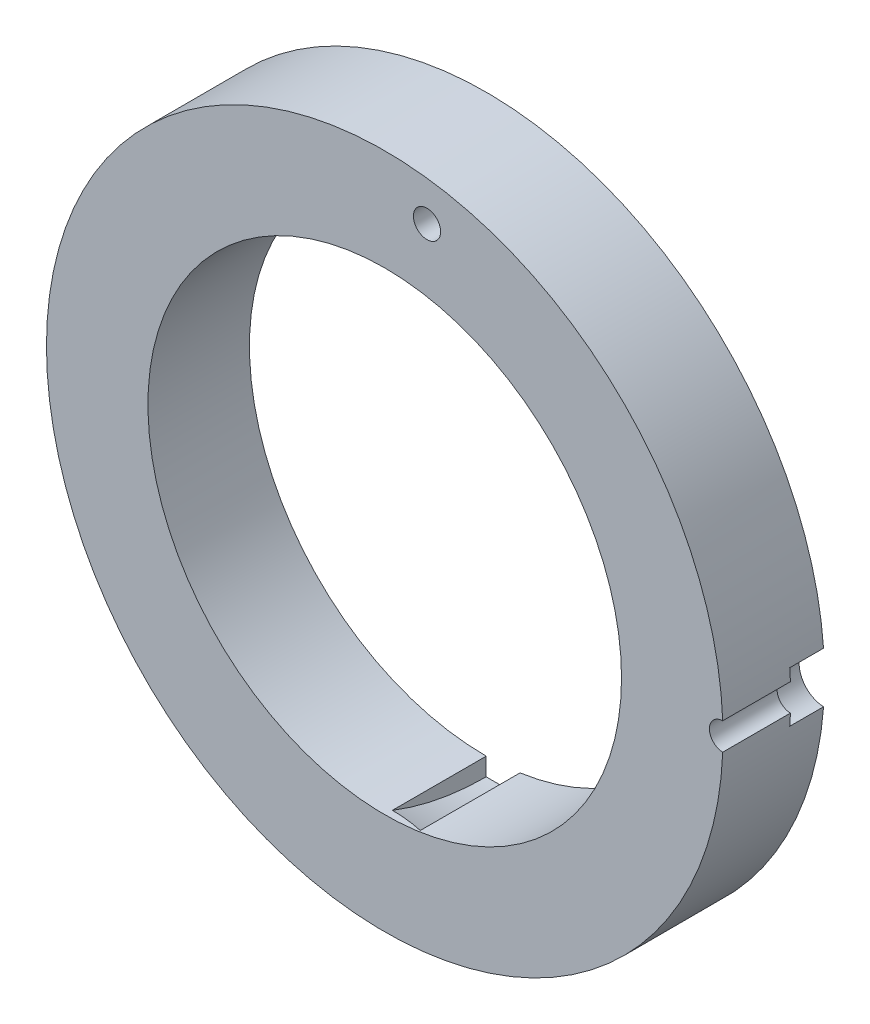
ISO-10303-21;
HEADER;
FILE_DESCRIPTION(('STEP AP214'),'2;1');
FILE_NAME('part.step','',(''),(''),'','','');
FILE_SCHEMA(('AUTOMOTIVE_DESIGN { 1 0 10303 214 1 1 1 1 }'));
ENDSEC;
DATA;
#1=APPLICATION_CONTEXT('core data for automotive mechanical design processes');
#2=APPLICATION_PROTOCOL_DEFINITION('international standard','automotive_design',2000,#1);
#3=PRODUCT_CONTEXT('',#1,'mechanical');
#4=PRODUCT('Part','Part','',(#3));
#5=PRODUCT_RELATED_PRODUCT_CATEGORY('part','',(#4));
#6=PRODUCT_DEFINITION_FORMATION('','',#4);
#7=PRODUCT_DEFINITION_CONTEXT('part definition',#1,'design');
#8=PRODUCT_DEFINITION('design','',#6,#7);
#9=PRODUCT_DEFINITION_SHAPE('','',#8);
#10=(LENGTH_UNIT() NAMED_UNIT(*) SI_UNIT(.MILLI.,.METRE.));
#11=(NAMED_UNIT(*) PLANE_ANGLE_UNIT() SI_UNIT($,.RADIAN.));
#12=(NAMED_UNIT(*) SI_UNIT($,.STERADIAN.) SOLID_ANGLE_UNIT());
#13=UNCERTAINTY_MEASURE_WITH_UNIT(LENGTH_MEASURE(1.E-05),#10,'distance_accuracy_value','');
#14=(GEOMETRIC_REPRESENTATION_CONTEXT(3) GLOBAL_UNCERTAINTY_ASSIGNED_CONTEXT((#13)) GLOBAL_UNIT_ASSIGNED_CONTEXT((#10,
#11,#12)) REPRESENTATION_CONTEXT('',''));
#15=CARTESIAN_POINT('',(0.,0.,0.));
#16=DIRECTION('',(0.,0.,1.));
#17=DIRECTION('',(1.,0.,0.));
#18=AXIS2_PLACEMENT_3D('',#15,#16,#17);
#19=CARTESIAN_POINT('',(0.,0.,19.05));
#20=DIRECTION('',(0.,0.,-1.));
#21=DIRECTION('',(-1.,0.,0.));
#22=AXIS2_PLACEMENT_3D('',#19,#20,#21);
#23=CYLINDRICAL_SURFACE('',#22,63.5);
#24=DIRECTION('',(0.,0.,-1.));
#25=VECTOR('',#24,1.);
#26=CARTESIAN_POINT('',(63.32140625,-4.75915018910529,3.175));
#27=LINE('',#26,#25);
#28=CARTESIAN_POINT('',(63.32140625,-4.75915018910529,6.35));
#29=VERTEX_POINT('',#28);
#30=CARTESIAN_POINT('',(63.32140625,-4.75915018910529,0.));
#31=VERTEX_POINT('',#30);
#32=EDGE_CURVE('E120',#29,#31,#27,.T.);
#33=ORIENTED_EDGE('',*,*,#32,.F.);
#34=CARTESIAN_POINT('',(0.,0.,6.35));
#35=DIRECTION('',(0.,0.,1.));
#36=DIRECTION('',(1.,0.,0.));
#37=AXIS2_PLACEMENT_3D('',#34,#35,#36);
#38=CIRCLE('',#37,63.5);
#39=CARTESIAN_POINT('',(63.44869073,-2.55218428974322,6.35));
#40=VERTEX_POINT('',#39);
#41=EDGE_CURVE('E130',#29,#40,#38,.T.);
#42=ORIENTED_EDGE('',*,*,#41,.T.);
#43=DIRECTION('',(0.,0.,-1.));
#44=VECTOR('',#43,1.);
#45=CARTESIAN_POINT('',(63.44869073,-2.55218428974322,9.96501538869525));
#46=LINE('',#45,#44);
#47=CARTESIAN_POINT('',(63.44869073,-2.55218428974309,19.05));
#48=VERTEX_POINT('',#47);
#49=EDGE_CURVE('E200',#48,#40,#46,.T.);
#50=ORIENTED_EDGE('',*,*,#49,.F.);
#51=CARTESIAN_POINT('',(0.,0.,19.05));
#52=DIRECTION('',(0.,0.,1.));
#53=DIRECTION('',(1.,0.,0.));
#54=AXIS2_PLACEMENT_3D('',#51,#52,#53);
#55=CIRCLE('',#54,63.5);
#56=CARTESIAN_POINT('',(63.44869073,2.55218428974309,19.05));
#57=VERTEX_POINT('',#56);
#58=EDGE_CURVE('E134',#57,#48,#55,.T.);
#59=ORIENTED_EDGE('',*,*,#58,.F.);
#60=DIRECTION('',(0.,0.,-1.));
#61=VECTOR('',#60,1.);
#62=CARTESIAN_POINT('',(63.44869073,2.55218428974322,9.96501538869525));
#63=LINE('',#62,#61);
#64=CARTESIAN_POINT('',(63.44869073,2.55218428974322,6.35));
#65=VERTEX_POINT('',#64);
#66=EDGE_CURVE('E198',#65,#57,#63,.F.);
#67=ORIENTED_EDGE('',*,*,#66,.F.);
#68=CARTESIAN_POINT('',(63.32140625,4.75915018910529,6.35));
#69=VERTEX_POINT('',#68);
#70=EDGE_CURVE('E52',#65,#69,#38,.T.);
#71=ORIENTED_EDGE('',*,*,#70,.T.);
#72=DIRECTION('',(0.,0.,-1.));
#73=VECTOR('',#72,1.);
#74=CARTESIAN_POINT('',(63.32140625,4.75915018910529,3.175));
#75=LINE('',#74,#73);
#76=CARTESIAN_POINT('',(63.32140625,4.75915018910529,0.));
#77=VERTEX_POINT('',#76);
#78=EDGE_CURVE('E118',#77,#69,#75,.F.);
#79=ORIENTED_EDGE('',*,*,#78,.F.);
#80=CARTESIAN_POINT('',(0.,0.,0.));
#81=DIRECTION('',(0.,0.,1.));
#82=DIRECTION('',(1.,0.,0.));
#83=AXIS2_PLACEMENT_3D('',#80,#81,#82);
#84=CIRCLE('',#83,63.5);
#85=EDGE_CURVE('E128',#77,#31,#84,.T.);
#86=ORIENTED_EDGE('',*,*,#85,.T.);
#87=EDGE_LOOP('',(#33,#42,#50,#59,#67,#71,#79,#86));
#88=FACE_BOUND('',#87,.T.);
#89=ADVANCED_FACE('F39',(#88),#23,.T.);
#90=CARTESIAN_POINT('',(0.,0.,19.05));
#91=DIRECTION('',(0.,0.,1.));
#92=DIRECTION('',(1.,0.,0.));
#93=AXIS2_PLACEMENT_3D('',#90,#91,#92);
#94=PLANE('',#93);
#95=CARTESIAN_POINT('',(7.9375,55.5625,19.05));
#96=DIRECTION('',(0.,0.,1.));
#97=DIRECTION('',(1.,0.,0.));
#98=AXIS2_PLACEMENT_3D('',#95,#96,#97);
#99=CIRCLE('',#98,2.5527);
#100=CARTESIAN_POINT('',(10.4902,55.5625,19.05));
#101=VERTEX_POINT('',#100);
#102=EDGE_CURVE('E203',#101,#101,#99,.F.);
#103=ORIENTED_EDGE('',*,*,#102,.T.);
#104=EDGE_LOOP('',(#103));
#105=FACE_BOUND('',#104,.T.);
#106=CARTESIAN_POINT('',(0.,0.,19.05));
#107=DIRECTION('',(0.,0.,1.));
#108=DIRECTION('',(1.,0.,0.));
#109=AXIS2_PLACEMENT_3D('',#106,#107,#108);
#110=CIRCLE('',#109,44.45);
#111=CARTESIAN_POINT('',(44.45,0.,19.05));
#112=VERTEX_POINT('',#111);
#113=EDGE_CURVE('E135',#112,#112,#110,.T.);
#114=ORIENTED_EDGE('',*,*,#113,.F.);
#115=EDGE_LOOP('',(#114));
#116=FACE_BOUND('',#115,.T.);
#117=ORIENTED_EDGE('',*,*,#58,.T.);
#118=CARTESIAN_POINT('',(63.5,0.,19.05));
#119=DIRECTION('',(0.,0.,1.));
#120=DIRECTION('',(1.,0.,0.));
#121=AXIS2_PLACEMENT_3D('',#118,#119,#120);
#122=CIRCLE('',#121,2.55270000000001);
#123=EDGE_CURVE('E195',#48,#57,#122,.F.);
#124=ORIENTED_EDGE('',*,*,#123,.T.);
#125=EDGE_LOOP('',(#117,#124));
#126=FACE_BOUND('',#125,.T.);
#127=ADVANCED_FACE('F260',(#105,#116,#126),#94,.T.);
#128=CARTESIAN_POINT('',(0.,0.,0.));
#129=DIRECTION('',(0.,0.,1.));
#130=DIRECTION('',(1.,0.,0.));
#131=AXIS2_PLACEMENT_3D('',#128,#129,#130);
#132=PLANE('',#131);
#133=CARTESIAN_POINT('',(7.9375,55.5625,0.));
#134=DIRECTION('',(0.,0.,1.));
#135=DIRECTION('',(1.,0.,0.));
#136=AXIS2_PLACEMENT_3D('',#133,#134,#135);
#137=CIRCLE('',#136,4.7625);
#138=CARTESIAN_POINT('',(12.7,55.5625,0.));
#139=VERTEX_POINT('',#138);
#140=EDGE_CURVE('E182',#139,#139,#137,.T.);
#141=ORIENTED_EDGE('',*,*,#140,.T.);
#142=EDGE_LOOP('',(#141));
#143=FACE_BOUND('',#142,.T.);
#144=CARTESIAN_POINT('',(63.5,0.,0.));
#145=DIRECTION('',(0.,0.,1.));
#146=DIRECTION('',(1.,0.,0.));
#147=AXIS2_PLACEMENT_3D('',#144,#145,#146);
#148=CIRCLE('',#147,4.7625);
#149=EDGE_CURVE('E114',#77,#31,#148,.T.);
#150=ORIENTED_EDGE('',*,*,#149,.T.);
#151=ORIENTED_EDGE('',*,*,#85,.F.);
#152=EDGE_LOOP('',(#150,#151));
#153=FACE_BOUND('',#152,.T.);
#154=DIRECTION('',(-1.,0.,0.));
#155=VECTOR('',#154,1.);
#156=CARTESIAN_POINT('',(6.35,-47.8155,0.));
#157=LINE('',#156,#155);
#158=CARTESIAN_POINT('',(6.35,-47.8155,0.));
#159=VERTEX_POINT('',#158);
#160=CARTESIAN_POINT('',(0.,-47.8155,0.));
#161=VERTEX_POINT('',#160);
#162=EDGE_CURVE('E219',#159,#161,#157,.T.);
#163=ORIENTED_EDGE('',*,*,#162,.F.);
#164=DIRECTION('',(0.,1.,0.));
#165=VECTOR('',#164,1.);
#166=CARTESIAN_POINT('',(6.35,0.,0.));
#167=LINE('',#166,#165);
#168=CARTESIAN_POINT('',(6.35,-43.9940905122495,0.));
#169=VERTEX_POINT('',#168);
#170=EDGE_CURVE('E218',#159,#169,#167,.T.);
#171=ORIENTED_EDGE('',*,*,#170,.T.);
#172=CARTESIAN_POINT('',(0.,0.,0.));
#173=DIRECTION('',(0.,0.,1.));
#174=DIRECTION('',(1.,0.,0.));
#175=AXIS2_PLACEMENT_3D('',#172,#173,#174);
#176=CIRCLE('',#175,44.45);
#177=CARTESIAN_POINT('',(6.35,43.9940905122495,0.));
#178=VERTEX_POINT('',#177);
#179=EDGE_CURVE('E222',#169,#178,#176,.T.);
#180=ORIENTED_EDGE('',*,*,#179,.T.);
#181=CARTESIAN_POINT('',(6.35,47.8155,0.));
#182=VERTEX_POINT('',#181);
#183=EDGE_CURVE('E215',#178,#182,#167,.T.);
#184=ORIENTED_EDGE('',*,*,#183,.T.);
#185=DIRECTION('',(-1.,0.,0.));
#186=VECTOR('',#185,1.);
#187=CARTESIAN_POINT('',(6.35,47.8155,0.));
#188=LINE('',#187,#186);
#189=CARTESIAN_POINT('',(0.,47.8155,0.));
#190=VERTEX_POINT('',#189);
#191=EDGE_CURVE('E221',#190,#182,#188,.F.);
#192=ORIENTED_EDGE('',*,*,#191,.F.);
#193=DIRECTION('',(0.,1.,0.));
#194=VECTOR('',#193,1.);
#195=CARTESIAN_POINT('',(0.,0.,0.));
#196=LINE('',#195,#194);
#197=CARTESIAN_POINT('',(0.,44.45,0.));
#198=VERTEX_POINT('',#197);
#199=EDGE_CURVE('E210',#198,#190,#196,.T.);
#200=ORIENTED_EDGE('',*,*,#199,.F.);
#201=CARTESIAN_POINT('',(0.,-44.45,0.));
#202=VERTEX_POINT('',#201);
#203=EDGE_CURVE('E141',#198,#202,#176,.T.);
#204=ORIENTED_EDGE('',*,*,#203,.T.);
#205=EDGE_CURVE('E214',#161,#202,#196,.T.);
#206=ORIENTED_EDGE('',*,*,#205,.F.);
#207=EDGE_LOOP('',(#163,#171,#180,#184,#192,#200,#204,#206));
#208=FACE_BOUND('',#207,.T.);
#209=ADVANCED_FACE('F132',(#143,#153,#208),#132,.F.);
#210=CARTESIAN_POINT('',(0.,0.,19.05));
#211=DIRECTION('',(0.,0.,-1.));
#212=DIRECTION('',(-1.,0.,0.));
#213=AXIS2_PLACEMENT_3D('',#210,#211,#212);
#214=CYLINDRICAL_SURFACE('',#213,44.45);
#215=DIRECTION('',(0.,0.,-1.));
#216=VECTOR('',#215,1.);
#217=CARTESIAN_POINT('',(6.35,-43.9940905122495,19.05));
#218=LINE('',#217,#216);
#219=CARTESIAN_POINT('',(6.35,-43.9940905122495,18.7307778869432));
#220=VERTEX_POINT('',#219);
#221=EDGE_CURVE('E46',#220,#169,#218,.T.);
#222=ORIENTED_EDGE('',*,*,#221,.F.);
#223=CARTESIAN_POINT('',(6.35,-43.9940905122495,18.7307778869432));
#224=CARTESIAN_POINT('',(5.8403767387304,-44.0676880298133,18.5578695028612));
#225=CARTESIAN_POINT('',(5.32363311670187,-44.1331928673133,18.4012197606708));
#226=CARTESIAN_POINT('',(4.28231557253196,-44.2463057731875,18.1275685305138));
#227=CARTESIAN_POINT('',(3.75783559851142,-44.2940509678612,18.010263972673));
#228=CARTESIAN_POINT('',(2.69915141579541,-44.3711469318542,17.8194840371905));
#229=CARTESIAN_POINT('',(2.16494378165357,-44.4004910873964,17.7460244189341));
#230=CARTESIAN_POINT('',(1.35780253622842,-44.4300830776957,17.6717405234047));
#231=CARTESIAN_POINT('',(1.08667822297062,-44.4375435566796,17.6529613392195));
#232=CARTESIAN_POINT('',(0.543719005705914,-44.4475047073642,17.6278600265607));
#233=CARTESIAN_POINT('',(0.271883990841782,-44.4500045525698,17.6215399739139));
#234=CARTESIAN_POINT('',(0.,-44.45,17.6215646368306));
#235=B_SPLINE_CURVE_WITH_KNOTS('',3,(#223,#224,#225,#226,#227,#228,#229,#230,#231,#232,#233,
#234),.UNSPECIFIED.,.F.,.F.,(4,2,2,2,2,4),(0.,1.62974309267368,3.24662764720383,
4.86409301643608,5.6794305159545,6.49490384808952),.UNSPECIFIED.);
#236=CARTESIAN_POINT('',(0.,-44.45,17.6215646368306));
#237=VERTEX_POINT('',#236);
#238=EDGE_CURVE('E172',#220,#237,#235,.T.);
#239=ORIENTED_EDGE('',*,*,#238,.T.);
#240=DIRECTION('',(0.,0.,-1.));
#241=VECTOR('',#240,1.);
#242=CARTESIAN_POINT('',(0.,-44.45,19.05));
#243=LINE('',#242,#241);
#244=EDGE_CURVE('E179',#237,#202,#243,.T.);
#245=ORIENTED_EDGE('',*,*,#244,.T.);
#246=ORIENTED_EDGE('',*,*,#203,.F.);
#247=DIRECTION('',(0.,0.,-1.));
#248=VECTOR('',#247,1.);
#249=CARTESIAN_POINT('',(0.,44.45,19.05));
#250=LINE('',#249,#248);
#251=CARTESIAN_POINT('',(0.,44.45,17.6215646368306));
#252=VERTEX_POINT('',#251);
#253=EDGE_CURVE('E138',#198,#252,#250,.F.);
#254=ORIENTED_EDGE('',*,*,#253,.T.);
#255=CARTESIAN_POINT('',(0.,44.45,17.6215646368306));
#256=CARTESIAN_POINT('',(0.271883990841779,44.4500045525698,17.6215399739139));
#257=CARTESIAN_POINT('',(0.543719005705911,44.4475047073642,17.6278600265607));
#258=CARTESIAN_POINT('',(1.08667822297062,44.4375435566796,17.6529613392195));
#259=CARTESIAN_POINT('',(1.35780253622842,44.4300830776957,17.6717405234047));
#260=CARTESIAN_POINT('',(2.16494378165357,44.4004910873964,17.7460244189341));
#261=CARTESIAN_POINT('',(2.69915141579541,44.3711469318542,17.8194840371905));
#262=CARTESIAN_POINT('',(3.75783559851142,44.2940509678612,18.010263972673));
#263=CARTESIAN_POINT('',(4.28231557253195,44.2463057731875,18.1275685305138));
#264=CARTESIAN_POINT('',(5.32363311670187,44.1331928673133,18.4012197606708));
#265=CARTESIAN_POINT('',(5.8403767387304,44.0676880298133,18.5578695028612));
#266=CARTESIAN_POINT('',(6.35,43.9940905122495,18.7307778869432));
#267=B_SPLINE_CURVE_WITH_KNOTS('',3,(#255,#256,#257,#258,#259,#260,#261,#262,#263,#264,#265,
#266),.UNSPECIFIED.,.F.,.F.,(4,2,2,2,2,4),(0.,0.81547333213502,1.63081083165344,
3.24827620088569,4.86516075541584,6.49490384808952),.UNSPECIFIED.);
#268=CARTESIAN_POINT('',(6.35,43.9940905122495,18.7307778869432));
#269=VERTEX_POINT('',#268);
#270=EDGE_CURVE('E147',#252,#269,#267,.T.);
#271=ORIENTED_EDGE('',*,*,#270,.T.);
#272=DIRECTION('',(0.,0.,-1.));
#273=VECTOR('',#272,1.);
#274=CARTESIAN_POINT('',(6.35,43.9940905122495,19.05));
#275=LINE('',#274,#273);
#276=EDGE_CURVE('E156',#178,#269,#275,.F.);
#277=ORIENTED_EDGE('',*,*,#276,.F.);
#278=ORIENTED_EDGE('',*,*,#179,.F.);
#279=EDGE_LOOP('',(#222,#239,#245,#246,#254,#271,#277,#278));
#280=FACE_BOUND('',#279,.T.);
#281=ORIENTED_EDGE('',*,*,#113,.T.);
#282=EDGE_LOOP('',(#281));
#283=FACE_BOUND('',#282,.T.);
#284=ADVANCED_FACE('F158',(#280,#283),#214,.F.);
#285=CARTESIAN_POINT('',(6.35,0.,0.));
#286=DIRECTION('',(1.,0.,0.));
#287=DIRECTION('',(0.,0.,-1.));
#288=AXIS2_PLACEMENT_3D('',#285,#286,#287);
#289=PLANE('',#288);
#290=ORIENTED_EDGE('',*,*,#276,.T.);
#291=CARTESIAN_POINT('',(6.35,0.,0.));
#292=DIRECTION('',(1.,0.,0.));
#293=DIRECTION('',(0.,0.,-1.));
#294=AXIS2_PLACEMENT_3D('',#291,#292,#293);
#295=CIRCLE('',#294,47.8155);
#296=EDGE_CURVE('E207',#182,#269,#295,.T.);
#297=ORIENTED_EDGE('',*,*,#296,.F.);
#298=ORIENTED_EDGE('',*,*,#183,.F.);
#299=EDGE_LOOP('',(#290,#297,#298));
#300=FACE_BOUND('',#299,.T.);
#301=ADVANCED_FACE('F242',(#300),#289,.F.);
#302=CARTESIAN_POINT('',(0.,0.,0.));
#303=DIRECTION('',(1.,0.,0.));
#304=DIRECTION('',(0.,0.,-1.));
#305=AXIS2_PLACEMENT_3D('',#302,#303,#304);
#306=PLANE('',#305);
#307=ORIENTED_EDGE('',*,*,#199,.T.);
#308=CARTESIAN_POINT('',(0.,0.,0.));
#309=DIRECTION('',(1.,0.,0.));
#310=DIRECTION('',(0.,0.,-1.));
#311=AXIS2_PLACEMENT_3D('',#308,#309,#310);
#312=CIRCLE('',#311,47.8155);
#313=EDGE_CURVE('E60',#190,#252,#312,.T.);
#314=ORIENTED_EDGE('',*,*,#313,.T.);
#315=ORIENTED_EDGE('',*,*,#253,.F.);
#316=EDGE_LOOP('',(#307,#314,#315));
#317=FACE_BOUND('',#316,.T.);
#318=ADVANCED_FACE('F166',(#317),#306,.T.);
#319=CARTESIAN_POINT('',(6.35,0.,0.));
#320=DIRECTION('',(-1.,0.,0.));
#321=DIRECTION('',(0.,0.,1.));
#322=AXIS2_PLACEMENT_3D('',#319,#320,#321);
#323=CYLINDRICAL_SURFACE('',#322,47.8155);
#324=ORIENTED_EDGE('',*,*,#191,.T.);
#325=ORIENTED_EDGE('',*,*,#296,.T.);
#326=ORIENTED_EDGE('',*,*,#270,.F.);
#327=ORIENTED_EDGE('',*,*,#313,.F.);
#328=EDGE_LOOP('',(#324,#325,#326,#327));
#329=FACE_BOUND('',#328,.T.);
#330=ADVANCED_FACE('F161',(#329),#323,.F.);
#331=ORIENTED_EDGE('',*,*,#162,.T.);
#332=EDGE_CURVE('E206',#237,#161,#312,.T.);
#333=ORIENTED_EDGE('',*,*,#332,.F.);
#334=ORIENTED_EDGE('',*,*,#238,.F.);
#335=EDGE_CURVE('E211',#220,#159,#295,.T.);
#336=ORIENTED_EDGE('',*,*,#335,.T.);
#337=EDGE_LOOP('',(#331,#333,#334,#336));
#338=FACE_BOUND('',#337,.T.);
#339=ADVANCED_FACE('F165',(#338),#323,.F.);
#340=ORIENTED_EDGE('',*,*,#335,.F.);
#341=ORIENTED_EDGE('',*,*,#221,.T.);
#342=ORIENTED_EDGE('',*,*,#170,.F.);
#343=EDGE_LOOP('',(#340,#341,#342));
#344=FACE_BOUND('',#343,.T.);
#345=ADVANCED_FACE('F245',(#344),#289,.F.);
#346=ORIENTED_EDGE('',*,*,#205,.T.);
#347=ORIENTED_EDGE('',*,*,#244,.F.);
#348=ORIENTED_EDGE('',*,*,#332,.T.);
#349=EDGE_LOOP('',(#346,#347,#348));
#350=FACE_BOUND('',#349,.T.);
#351=ADVANCED_FACE('F168',(#350),#306,.T.);
#352=CARTESIAN_POINT('',(63.5,0.,19.9300307773905));
#353=DIRECTION('',(0.,0.,-1.));
#354=DIRECTION('',(-1.,0.,0.));
#355=AXIS2_PLACEMENT_3D('',#352,#353,#354);
#356=CYLINDRICAL_SURFACE('',#355,2.55270000000001);
#357=CARTESIAN_POINT('',(63.5,0.,6.35));
#358=DIRECTION('',(0.,0.,1.));
#359=DIRECTION('',(1.,0.,0.));
#360=AXIS2_PLACEMENT_3D('',#357,#358,#359);
#361=CIRCLE('',#360,2.55270000000001);
#362=EDGE_CURVE('E11',#65,#40,#361,.T.);
#363=ORIENTED_EDGE('',*,*,#362,.F.);
#364=ORIENTED_EDGE('',*,*,#66,.T.);
#365=ORIENTED_EDGE('',*,*,#123,.F.);
#366=ORIENTED_EDGE('',*,*,#49,.T.);
#367=EDGE_LOOP('',(#363,#364,#365,#366));
#368=FACE_BOUND('',#367,.T.);
#369=ADVANCED_FACE('F249',(#368),#356,.F.);
#370=CARTESIAN_POINT('',(7.9375,55.5625,19.9300307773905));
#371=DIRECTION('',(0.,0.,-1.));
#372=DIRECTION('',(-1.,0.,0.));
#373=AXIS2_PLACEMENT_3D('',#370,#371,#372);
#374=CYLINDRICAL_SURFACE('',#373,2.5527);
#375=CARTESIAN_POINT('',(7.9375,55.5625,6.35));
#376=DIRECTION('',(0.,0.,1.));
#377=DIRECTION('',(1.,0.,0.));
#378=AXIS2_PLACEMENT_3D('',#375,#376,#377);
#379=CIRCLE('',#378,2.5527);
#380=CARTESIAN_POINT('',(10.4902,55.5625,6.35));
#381=VERTEX_POINT('',#380);
#382=EDGE_CURVE('E180',#381,#381,#379,.T.);
#383=ORIENTED_EDGE('',*,*,#382,.F.);
#384=EDGE_LOOP('',(#383));
#385=FACE_BOUND('',#384,.T.);
#386=ORIENTED_EDGE('',*,*,#102,.F.);
#387=EDGE_LOOP('',(#386));
#388=FACE_BOUND('',#387,.T.);
#389=ADVANCED_FACE('F255',(#385,#388),#374,.F.);
#390=CARTESIAN_POINT('',(7.9375,55.5625,6.35));
#391=DIRECTION('',(0.,0.,-1.));
#392=DIRECTION('',(-1.,0.,0.));
#393=AXIS2_PLACEMENT_3D('',#390,#391,#392);
#394=CYLINDRICAL_SURFACE('',#393,4.7625);
#395=CARTESIAN_POINT('',(7.9375,55.5625,6.35));
#396=DIRECTION('',(0.,0.,1.));
#397=DIRECTION('',(1.,0.,0.));
#398=AXIS2_PLACEMENT_3D('',#395,#396,#397);
#399=CIRCLE('',#398,4.7625);
#400=CARTESIAN_POINT('',(12.7,55.5625,6.35));
#401=VERTEX_POINT('',#400);
#402=EDGE_CURVE('E124',#401,#401,#399,.T.);
#403=ORIENTED_EDGE('',*,*,#402,.T.);
#404=EDGE_LOOP('',(#403));
#405=FACE_BOUND('',#404,.T.);
#406=ORIENTED_EDGE('',*,*,#140,.F.);
#407=EDGE_LOOP('',(#406));
#408=FACE_BOUND('',#407,.T.);
#409=ADVANCED_FACE('F285',(#405,#408),#394,.F.);
#410=CARTESIAN_POINT('',(7.9375,55.5625,6.35));
#411=DIRECTION('',(0.,0.,1.));
#412=DIRECTION('',(1.,0.,0.));
#413=AXIS2_PLACEMENT_3D('',#410,#411,#412);
#414=PLANE('',#413);
#415=ORIENTED_EDGE('',*,*,#382,.T.);
#416=EDGE_LOOP('',(#415));
#417=FACE_BOUND('',#416,.T.);
#418=ORIENTED_EDGE('',*,*,#402,.F.);
#419=EDGE_LOOP('',(#418));
#420=FACE_BOUND('',#419,.T.);
#421=ADVANCED_FACE('F280',(#417,#420),#414,.F.);
#422=CARTESIAN_POINT('',(63.5,0.,6.35));
#423=DIRECTION('',(0.,0.,-1.));
#424=DIRECTION('',(-1.,0.,0.));
#425=AXIS2_PLACEMENT_3D('',#422,#423,#424);
#426=CYLINDRICAL_SURFACE('',#425,4.7625);
#427=ORIENTED_EDGE('',*,*,#32,.T.);
#428=ORIENTED_EDGE('',*,*,#149,.F.);
#429=ORIENTED_EDGE('',*,*,#78,.T.);
#430=CARTESIAN_POINT('',(63.5,0.,6.35));
#431=DIRECTION('',(0.,0.,1.));
#432=DIRECTION('',(1.,0.,0.));
#433=AXIS2_PLACEMENT_3D('',#430,#431,#432);
#434=CIRCLE('',#433,4.7625);
#435=EDGE_CURVE('E125',#69,#29,#434,.T.);
#436=ORIENTED_EDGE('',*,*,#435,.T.);
#437=EDGE_LOOP('',(#427,#428,#429,#436));
#438=FACE_BOUND('',#437,.T.);
#439=ADVANCED_FACE('F116',(#438),#426,.F.);
#440=CARTESIAN_POINT('',(63.5,0.,6.35));
#441=DIRECTION('',(0.,0.,1.));
#442=DIRECTION('',(1.,0.,0.));
#443=AXIS2_PLACEMENT_3D('',#440,#441,#442);
#444=PLANE('',#443);
#445=ORIENTED_EDGE('',*,*,#435,.F.);
#446=ORIENTED_EDGE('',*,*,#70,.F.);
#447=ORIENTED_EDGE('',*,*,#362,.T.);
#448=ORIENTED_EDGE('',*,*,#41,.F.);
#449=EDGE_LOOP('',(#445,#446,#447,#448));
#450=FACE_BOUND('',#449,.T.);
#451=ADVANCED_FACE('F274',(#450),#444,.F.);
#452=CLOSED_SHELL('',(#89,#127,#209,#284,#301,#318,#330,#339,#345,#351,#369,#389,#409,#421,#439,#451));
#453=MANIFOLD_SOLID_BREP('B2',#452);
#454=ADVANCED_BREP_SHAPE_REPRESENTATION('',(#18,#453),#14);
#455=SHAPE_DEFINITION_REPRESENTATION(#9,#454);
ENDSEC;
END-ISO-10303-21;
